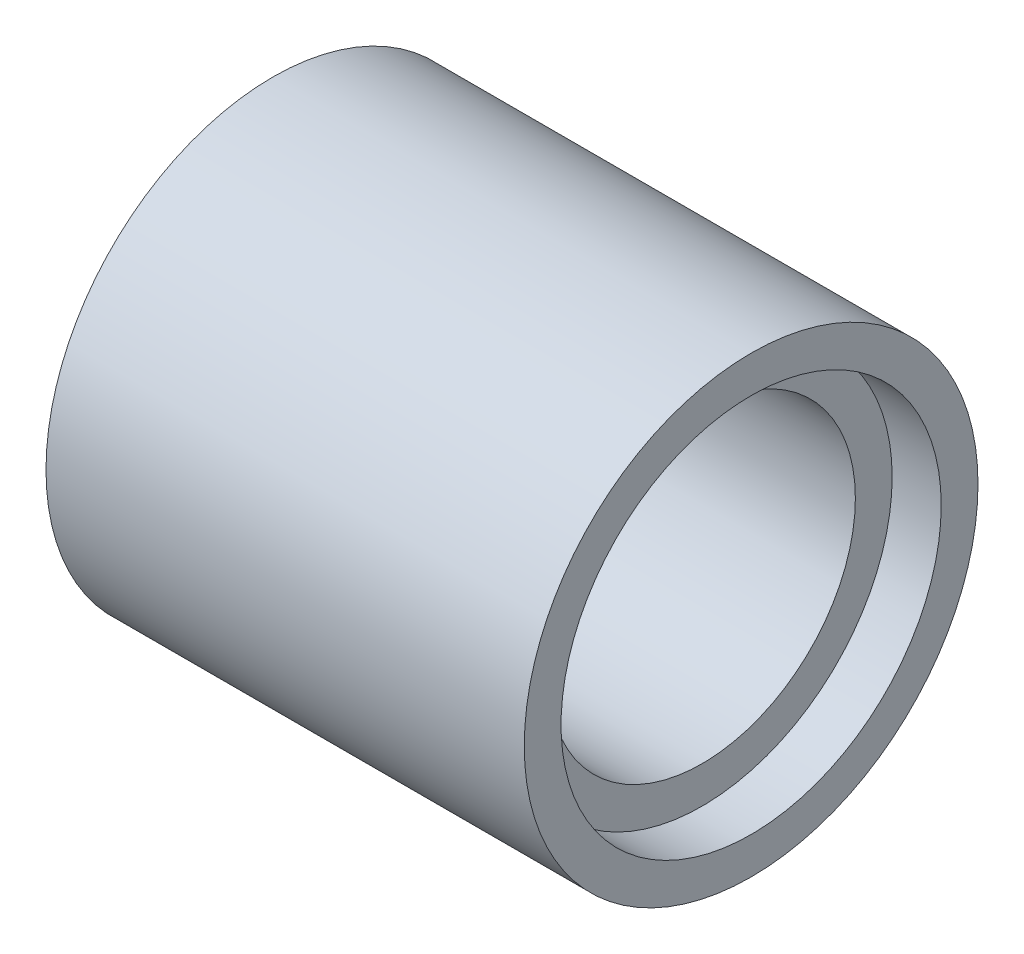
ISO-10303-21;
HEADER;
FILE_DESCRIPTION(('STEP AP214'),'2;1');
FILE_NAME('part.step','',(''),(''),'','','');
FILE_SCHEMA(('AUTOMOTIVE_DESIGN { 1 0 10303 214 1 1 1 1 }'));
ENDSEC;
DATA;
#1=APPLICATION_CONTEXT('core data for automotive mechanical design processes');
#2=APPLICATION_PROTOCOL_DEFINITION('international standard','automotive_design',2000,#1);
#3=PRODUCT_CONTEXT('',#1,'mechanical');
#4=PRODUCT('Part','Part','',(#3));
#5=PRODUCT_RELATED_PRODUCT_CATEGORY('part','',(#4));
#6=PRODUCT_DEFINITION_FORMATION('','',#4);
#7=PRODUCT_DEFINITION_CONTEXT('part definition',#1,'design');
#8=PRODUCT_DEFINITION('design','',#6,#7);
#9=PRODUCT_DEFINITION_SHAPE('','',#8);
#10=(LENGTH_UNIT() NAMED_UNIT(*) SI_UNIT(.MILLI.,.METRE.));
#11=(NAMED_UNIT(*) PLANE_ANGLE_UNIT() SI_UNIT($,.RADIAN.));
#12=(NAMED_UNIT(*) SI_UNIT($,.STERADIAN.) SOLID_ANGLE_UNIT());
#13=UNCERTAINTY_MEASURE_WITH_UNIT(LENGTH_MEASURE(1.E-05),#10,'distance_accuracy_value','');
#14=(GEOMETRIC_REPRESENTATION_CONTEXT(3) GLOBAL_UNCERTAINTY_ASSIGNED_CONTEXT((#13)) GLOBAL_UNIT_ASSIGNED_CONTEXT((#10,
#11,#12)) REPRESENTATION_CONTEXT('',''));
#15=CARTESIAN_POINT('',(0.,0.,0.));
#16=DIRECTION('',(0.,0.,1.));
#17=DIRECTION('',(1.,0.,0.));
#18=AXIS2_PLACEMENT_3D('',#15,#16,#17);
#19=CARTESIAN_POINT('',(-3.9,0.,0.));
#20=DIRECTION('',(1.,0.,0.));
#21=DIRECTION('',(0.,0.,-1.));
#22=AXIS2_PLACEMENT_3D('',#19,#20,#21);
#23=CYLINDRICAL_SURFACE('',#22,2.5);
#24=CARTESIAN_POINT('',(3.1,0.,0.));
#25=DIRECTION('',(1.,0.,0.));
#26=DIRECTION('',(0.,0.,-1.));
#27=AXIS2_PLACEMENT_3D('',#24,#25,#26);
#28=CIRCLE('',#27,2.5);
#29=CARTESIAN_POINT('',(3.1,0.,-2.5));
#30=VERTEX_POINT('',#29);
#31=EDGE_CURVE('E50',#30,#30,#28,.T.);
#32=ORIENTED_EDGE('',*,*,#31,.T.);
#33=EDGE_LOOP('',(#32));
#34=FACE_BOUND('',#33,.T.);
#35=CARTESIAN_POINT('',(-3.1,0.,0.));
#36=DIRECTION('',(1.,0.,0.));
#37=DIRECTION('',(0.,0.,-1.));
#38=AXIS2_PLACEMENT_3D('',#35,#36,#37);
#39=CIRCLE('',#38,2.5);
#40=CARTESIAN_POINT('',(-3.1,0.,-2.5));
#41=VERTEX_POINT('',#40);
#42=EDGE_CURVE('E59',#41,#41,#39,.T.);
#43=ORIENTED_EDGE('',*,*,#42,.F.);
#44=EDGE_LOOP('',(#43));
#45=FACE_BOUND('',#44,.T.);
#46=ADVANCED_FACE('F34',(#34,#45),#23,.F.);
#47=CARTESIAN_POINT('',(3.9,0.,0.));
#48=DIRECTION('',(-1.,0.,0.));
#49=DIRECTION('',(0.,0.,1.));
#50=AXIS2_PLACEMENT_3D('',#47,#48,#49);
#51=CYLINDRICAL_SURFACE('',#50,3.7);
#52=CARTESIAN_POINT('',(3.9,0.,0.));
#53=DIRECTION('',(1.,0.,0.));
#54=DIRECTION('',(0.,0.,-1.));
#55=AXIS2_PLACEMENT_3D('',#52,#53,#54);
#56=CIRCLE('',#55,3.7);
#57=CARTESIAN_POINT('',(3.9,0.,-3.7));
#58=VERTEX_POINT('',#57);
#59=EDGE_CURVE('E10',#58,#58,#56,.T.);
#60=ORIENTED_EDGE('',*,*,#59,.F.);
#61=EDGE_LOOP('',(#60));
#62=FACE_BOUND('',#61,.T.);
#63=CARTESIAN_POINT('',(-3.9,0.,0.));
#64=DIRECTION('',(1.,0.,0.));
#65=DIRECTION('',(0.,0.,-1.));
#66=AXIS2_PLACEMENT_3D('',#63,#64,#65);
#67=CIRCLE('',#66,3.7);
#68=CARTESIAN_POINT('',(-3.9,0.,-3.7));
#69=VERTEX_POINT('',#68);
#70=EDGE_CURVE('E38',#69,#69,#67,.T.);
#71=ORIENTED_EDGE('',*,*,#70,.T.);
#72=EDGE_LOOP('',(#71));
#73=FACE_BOUND('',#72,.T.);
#74=ADVANCED_FACE('F36',(#62,#73),#51,.T.);
#75=CARTESIAN_POINT('',(3.9,0.,0.));
#76=DIRECTION('',(1.,0.,0.));
#77=DIRECTION('',(0.,0.,-1.));
#78=AXIS2_PLACEMENT_3D('',#75,#76,#77);
#79=PLANE('',#78);
#80=CARTESIAN_POINT('',(3.9,0.,0.));
#81=DIRECTION('',(1.,0.,0.));
#82=DIRECTION('',(0.,0.,-1.));
#83=AXIS2_PLACEMENT_3D('',#80,#81,#82);
#84=CIRCLE('',#83,3.1);
#85=CARTESIAN_POINT('',(3.9,0.,-3.1));
#86=VERTEX_POINT('',#85);
#87=EDGE_CURVE('E47',#86,#86,#84,.T.);
#88=ORIENTED_EDGE('',*,*,#87,.F.);
#89=EDGE_LOOP('',(#88));
#90=FACE_BOUND('',#89,.T.);
#91=ORIENTED_EDGE('',*,*,#59,.T.);
#92=EDGE_LOOP('',(#91));
#93=FACE_BOUND('',#92,.T.);
#94=ADVANCED_FACE('F74',(#90,#93),#79,.T.);
#95=CARTESIAN_POINT('',(-3.9,0.,0.));
#96=DIRECTION('',(1.,0.,0.));
#97=DIRECTION('',(0.,0.,-1.));
#98=AXIS2_PLACEMENT_3D('',#95,#96,#97);
#99=PLANE('',#98);
#100=CARTESIAN_POINT('',(-3.9,0.,0.));
#101=DIRECTION('',(1.,0.,0.));
#102=DIRECTION('',(0.,0.,-1.));
#103=AXIS2_PLACEMENT_3D('',#100,#101,#102);
#104=CIRCLE('',#103,3.1);
#105=CARTESIAN_POINT('',(-3.9,0.,-3.1));
#106=VERTEX_POINT('',#105);
#107=EDGE_CURVE('E56',#106,#106,#104,.T.);
#108=ORIENTED_EDGE('',*,*,#107,.T.);
#109=EDGE_LOOP('',(#108));
#110=FACE_BOUND('',#109,.T.);
#111=ORIENTED_EDGE('',*,*,#70,.F.);
#112=EDGE_LOOP('',(#111));
#113=FACE_BOUND('',#112,.T.);
#114=ADVANCED_FACE('F81',(#110,#113),#99,.F.);
#115=CARTESIAN_POINT('',(3.1,0.,0.));
#116=DIRECTION('',(1.,0.,0.));
#117=DIRECTION('',(0.,0.,-1.));
#118=AXIS2_PLACEMENT_3D('',#115,#116,#117);
#119=CYLINDRICAL_SURFACE('',#118,3.1);
#120=CARTESIAN_POINT('',(3.1,0.,0.));
#121=DIRECTION('',(1.,0.,0.));
#122=DIRECTION('',(0.,0.,-1.));
#123=AXIS2_PLACEMENT_3D('',#120,#121,#122);
#124=CIRCLE('',#123,3.1);
#125=CARTESIAN_POINT('',(3.1,0.,-3.1));
#126=VERTEX_POINT('',#125);
#127=EDGE_CURVE('E45',#126,#126,#124,.T.);
#128=ORIENTED_EDGE('',*,*,#127,.F.);
#129=EDGE_LOOP('',(#128));
#130=FACE_BOUND('',#129,.T.);
#131=ORIENTED_EDGE('',*,*,#87,.T.);
#132=EDGE_LOOP('',(#131));
#133=FACE_BOUND('',#132,.T.);
#134=ADVANCED_FACE('F78',(#130,#133),#119,.F.);
#135=CARTESIAN_POINT('',(3.1,0.,0.));
#136=DIRECTION('',(1.,0.,0.));
#137=DIRECTION('',(0.,0.,-1.));
#138=AXIS2_PLACEMENT_3D('',#135,#136,#137);
#139=PLANE('',#138);
#140=ORIENTED_EDGE('',*,*,#31,.F.);
#141=EDGE_LOOP('',(#140));
#142=FACE_BOUND('',#141,.T.);
#143=ORIENTED_EDGE('',*,*,#127,.T.);
#144=EDGE_LOOP('',(#143));
#145=FACE_BOUND('',#144,.T.);
#146=ADVANCED_FACE('F88',(#142,#145),#139,.T.);
#147=CARTESIAN_POINT('',(-3.1,0.,0.));
#148=DIRECTION('',(-1.,0.,0.));
#149=DIRECTION('',(0.,0.,1.));
#150=AXIS2_PLACEMENT_3D('',#147,#148,#149);
#151=CYLINDRICAL_SURFACE('',#150,3.1);
#152=CARTESIAN_POINT('',(-3.1,0.,0.));
#153=DIRECTION('',(1.,0.,0.));
#154=DIRECTION('',(0.,0.,-1.));
#155=AXIS2_PLACEMENT_3D('',#152,#153,#154);
#156=CIRCLE('',#155,3.1);
#157=CARTESIAN_POINT('',(-3.1,0.,-3.1));
#158=VERTEX_POINT('',#157);
#159=EDGE_CURVE('E51',#158,#158,#156,.T.);
#160=ORIENTED_EDGE('',*,*,#159,.T.);
#161=EDGE_LOOP('',(#160));
#162=FACE_BOUND('',#161,.T.);
#163=ORIENTED_EDGE('',*,*,#107,.F.);
#164=EDGE_LOOP('',(#163));
#165=FACE_BOUND('',#164,.T.);
#166=ADVANCED_FACE('F95',(#162,#165),#151,.F.);
#167=CARTESIAN_POINT('',(-3.1,0.,0.));
#168=DIRECTION('',(-1.,0.,0.));
#169=DIRECTION('',(0.,0.,-1.));
#170=AXIS2_PLACEMENT_3D('',#167,#168,#169);
#171=PLANE('',#170);
#172=ORIENTED_EDGE('',*,*,#42,.T.);
#173=EDGE_LOOP('',(#172));
#174=FACE_BOUND('',#173,.T.);
#175=ORIENTED_EDGE('',*,*,#159,.F.);
#176=EDGE_LOOP('',(#175));
#177=FACE_BOUND('',#176,.T.);
#178=ADVANCED_FACE('F65',(#174,#177),#171,.T.);
#179=CLOSED_SHELL('',(#46,#74,#94,#114,#134,#146,#166,#178));
#180=MANIFOLD_SOLID_BREP('B2',#179);
#181=ADVANCED_BREP_SHAPE_REPRESENTATION('',(#18,#180),#14);
#182=SHAPE_DEFINITION_REPRESENTATION(#9,#181);
ENDSEC;
END-ISO-10303-21;
